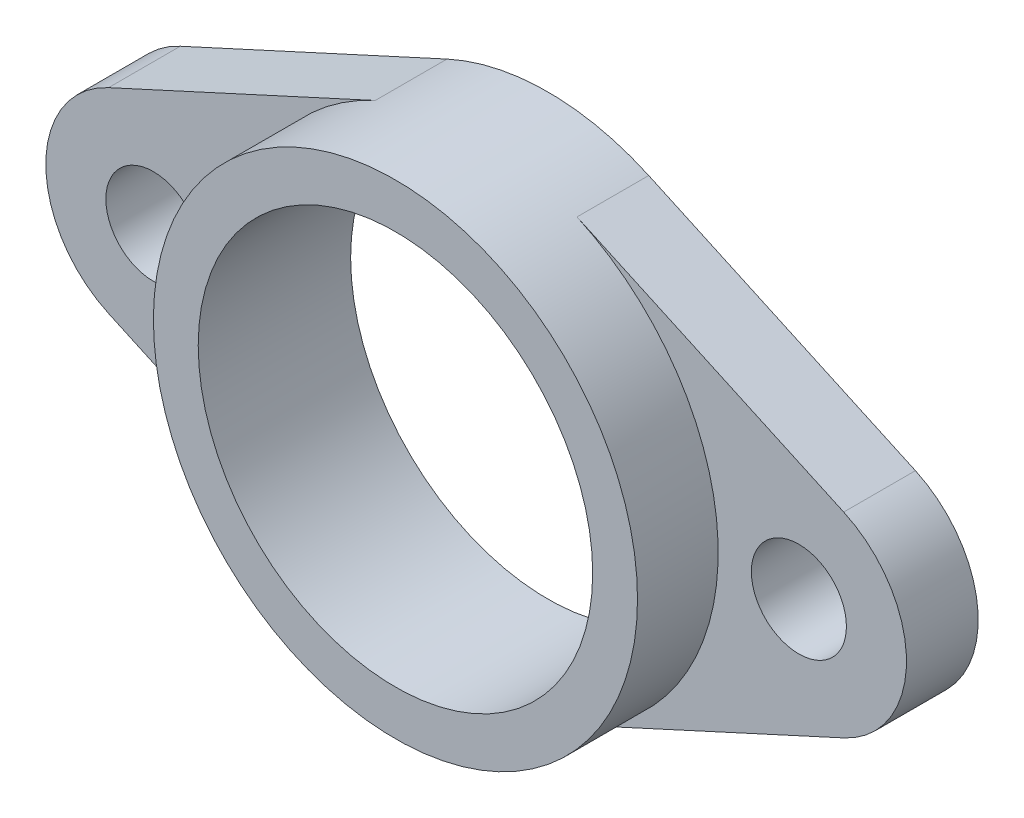
ISO-10303-21;
HEADER;
FILE_DESCRIPTION(('STEP AP214'),'2;1');
FILE_NAME('part.step','',(''),(''),'','','');
FILE_SCHEMA(('AUTOMOTIVE_DESIGN { 1 0 10303 214 1 1 1 1 }'));
ENDSEC;
DATA;
#1=APPLICATION_CONTEXT('core data for automotive mechanical design processes');
#2=APPLICATION_PROTOCOL_DEFINITION('international standard','automotive_design',2000,#1);
#3=PRODUCT_CONTEXT('',#1,'mechanical');
#4=PRODUCT('Part','Part','',(#3));
#5=PRODUCT_RELATED_PRODUCT_CATEGORY('part','',(#4));
#6=PRODUCT_DEFINITION_FORMATION('','',#4);
#7=PRODUCT_DEFINITION_CONTEXT('part definition',#1,'design');
#8=PRODUCT_DEFINITION('design','',#6,#7);
#9=PRODUCT_DEFINITION_SHAPE('','',#8);
#10=(LENGTH_UNIT() NAMED_UNIT(*) SI_UNIT(.MILLI.,.METRE.));
#11=(NAMED_UNIT(*) PLANE_ANGLE_UNIT() SI_UNIT($,.RADIAN.));
#12=(NAMED_UNIT(*) SI_UNIT($,.STERADIAN.) SOLID_ANGLE_UNIT());
#13=UNCERTAINTY_MEASURE_WITH_UNIT(LENGTH_MEASURE(1.E-05),#10,'distance_accuracy_value','');
#14=(GEOMETRIC_REPRESENTATION_CONTEXT(3) GLOBAL_UNCERTAINTY_ASSIGNED_CONTEXT((#13)) GLOBAL_UNIT_ASSIGNED_CONTEXT((#10,
#11,#12)) REPRESENTATION_CONTEXT('',''));
#15=CARTESIAN_POINT('',(0.,0.,0.));
#16=DIRECTION('',(0.,0.,1.));
#17=DIRECTION('',(1.,0.,0.));
#18=AXIS2_PLACEMENT_3D('',#15,#16,#17);
#19=CARTESIAN_POINT('',(-18.,0.,0.));
#20=DIRECTION('',(0.,0.,1.));
#21=DIRECTION('',(1.,0.,0.));
#22=AXIS2_PLACEMENT_3D('',#19,#20,#21);
#23=PLANE('',#22);
#24=CARTESIAN_POINT('',(18.,0.,0.));
#25=DIRECTION('',(0.,0.,-1.));
#26=DIRECTION('',(-1.,0.,0.));
#27=AXIS2_PLACEMENT_3D('',#24,#25,#26);
#28=CIRCLE('',#27,2.65);
#29=CARTESIAN_POINT('',(15.35,0.,0.));
#30=VERTEX_POINT('',#29);
#31=EDGE_CURVE('E195',#30,#30,#28,.T.);
#32=ORIENTED_EDGE('',*,*,#31,.F.);
#33=EDGE_LOOP('',(#32));
#34=FACE_BOUND('',#33,.T.);
#35=CARTESIAN_POINT('',(0.,0.,0.));
#36=DIRECTION('',(0.,0.,1.));
#37=DIRECTION('',(1.,0.,0.));
#38=AXIS2_PLACEMENT_3D('',#35,#36,#37);
#39=CIRCLE('',#38,13.5);
#40=CARTESIAN_POINT('',(-5.625,-12.2723011289652,0.));
#41=VERTEX_POINT('',#40);
#42=CARTESIAN_POINT('',(5.62499999999999,-12.2723011289652,0.));
#43=VERTEX_POINT('',#42);
#44=EDGE_CURVE('E144',#41,#43,#39,.T.);
#45=ORIENTED_EDGE('',*,*,#44,.F.);
#46=DIRECTION('',(0.90905934288631,-0.416666666666666,0.));
#47=VECTOR('',#46,1.);
#48=CARTESIAN_POINT('',(-20.5,-5.45435605731786,0.));
#49=LINE('',#48,#47);
#50=CARTESIAN_POINT('',(-20.5,-5.45435605731786,0.));
#51=VERTEX_POINT('',#50);
#52=EDGE_CURVE('E141',#51,#41,#49,.T.);
#53=ORIENTED_EDGE('',*,*,#52,.F.);
#54=CARTESIAN_POINT('',(-18.,0.,0.));
#55=DIRECTION('',(0.,0.,1.));
#56=DIRECTION('',(1.,0.,0.));
#57=AXIS2_PLACEMENT_3D('',#54,#55,#56);
#58=CIRCLE('',#57,6.);
#59=CARTESIAN_POINT('',(-20.5,5.45435605731786,0.));
#60=VERTEX_POINT('',#59);
#61=EDGE_CURVE('E138',#60,#51,#58,.T.);
#62=ORIENTED_EDGE('',*,*,#61,.F.);
#63=DIRECTION('',(-0.90905934288631,-0.416666666666666,0.));
#64=VECTOR('',#63,1.);
#65=CARTESIAN_POINT('',(-20.5,5.45435605731786,0.));
#66=LINE('',#65,#64);
#67=CARTESIAN_POINT('',(-5.625,12.2723011289652,0.));
#68=VERTEX_POINT('',#67);
#69=EDGE_CURVE('E89',#68,#60,#66,.T.);
#70=ORIENTED_EDGE('',*,*,#69,.F.);
#71=CARTESIAN_POINT('',(0.,0.,0.));
#72=DIRECTION('',(0.,0.,1.));
#73=DIRECTION('',(1.,0.,0.));
#74=AXIS2_PLACEMENT_3D('',#71,#72,#73);
#75=CIRCLE('',#74,13.5);
#76=CARTESIAN_POINT('',(5.625,12.2723011289652,0.));
#77=VERTEX_POINT('',#76);
#78=EDGE_CURVE('E83',#77,#68,#75,.T.);
#79=ORIENTED_EDGE('',*,*,#78,.F.);
#80=DIRECTION('',(-0.90905934288631,0.416666666666666,0.));
#81=VECTOR('',#80,1.);
#82=CARTESIAN_POINT('',(5.625,12.2723011289652,0.));
#83=LINE('',#82,#81);
#84=CARTESIAN_POINT('',(20.5,5.45435605731786,0.));
#85=VERTEX_POINT('',#84);
#86=EDGE_CURVE('E149',#85,#77,#83,.T.);
#87=ORIENTED_EDGE('',*,*,#86,.F.);
#88=CARTESIAN_POINT('',(18.,0.,0.));
#89=DIRECTION('',(0.,0.,1.));
#90=DIRECTION('',(1.,0.,0.));
#91=AXIS2_PLACEMENT_3D('',#88,#89,#90);
#92=CIRCLE('',#91,6.);
#93=CARTESIAN_POINT('',(20.5,-5.45435605731786,0.));
#94=VERTEX_POINT('',#93);
#95=EDGE_CURVE('E147',#94,#85,#92,.T.);
#96=ORIENTED_EDGE('',*,*,#95,.F.);
#97=DIRECTION('',(0.90905934288631,0.416666666666666,0.));
#98=VECTOR('',#97,1.);
#99=CARTESIAN_POINT('',(20.5,-5.45435605731786,0.));
#100=LINE('',#99,#98);
#101=EDGE_CURVE('E122',#43,#94,#100,.T.);
#102=ORIENTED_EDGE('',*,*,#101,.F.);
#103=EDGE_LOOP('',(#45,#53,#62,#70,#79,#87,#96,#102));
#104=FACE_BOUND('',#103,.T.);
#105=CARTESIAN_POINT('',(0.,0.,0.));
#106=DIRECTION('',(0.,0.,1.));
#107=DIRECTION('',(1.,0.,0.));
#108=AXIS2_PLACEMENT_3D('',#105,#106,#107);
#109=CIRCLE('',#108,11.);
#110=CARTESIAN_POINT('',(11.,0.,0.));
#111=VERTEX_POINT('',#110);
#112=EDGE_CURVE('E142',#111,#111,#109,.T.);
#113=ORIENTED_EDGE('',*,*,#112,.T.);
#114=EDGE_LOOP('',(#113));
#115=FACE_BOUND('',#114,.T.);
#116=CARTESIAN_POINT('',(-18.,0.,0.));
#117=DIRECTION('',(0.,0.,-1.));
#118=DIRECTION('',(-1.,0.,0.));
#119=AXIS2_PLACEMENT_3D('',#116,#117,#118);
#120=CIRCLE('',#119,2.65);
#121=CARTESIAN_POINT('',(-20.65,0.,0.));
#122=VERTEX_POINT('',#121);
#123=EDGE_CURVE('E201',#122,#122,#120,.T.);
#124=ORIENTED_EDGE('',*,*,#123,.F.);
#125=EDGE_LOOP('',(#124));
#126=FACE_BOUND('',#125,.T.);
#127=ADVANCED_FACE('F35',(#34,#104,#115,#126),#23,.F.);
#128=CARTESIAN_POINT('',(-18.,0.,4.));
#129=DIRECTION('',(0.,0.,1.));
#130=DIRECTION('',(1.,0.,0.));
#131=AXIS2_PLACEMENT_3D('',#128,#129,#130);
#132=PLANE('',#131);
#133=CARTESIAN_POINT('',(-18.,0.,4.));
#134=DIRECTION('',(0.,0.,1.));
#135=DIRECTION('',(1.,0.,0.));
#136=AXIS2_PLACEMENT_3D('',#133,#134,#135);
#137=CIRCLE('',#136,2.65);
#138=CARTESIAN_POINT('',(-15.35,0.,4.));
#139=VERTEX_POINT('',#138);
#140=EDGE_CURVE('E198',#139,#139,#137,.T.);
#141=ORIENTED_EDGE('',*,*,#140,.F.);
#142=EDGE_LOOP('',(#141));
#143=FACE_BOUND('',#142,.T.);
#144=DIRECTION('',(0.90905934288631,-0.416666666666666,0.));
#145=VECTOR('',#144,1.);
#146=CARTESIAN_POINT('',(-20.5,-5.45435605731786,4.));
#147=LINE('',#146,#145);
#148=CARTESIAN_POINT('',(-20.5,-5.45435605731786,4.));
#149=VERTEX_POINT('',#148);
#150=CARTESIAN_POINT('',(-5.625,-12.2723011289652,4.));
#151=VERTEX_POINT('',#150);
#152=EDGE_CURVE('E97',#149,#151,#147,.T.);
#153=ORIENTED_EDGE('',*,*,#152,.T.);
#154=CARTESIAN_POINT('',(0.,0.,4.));
#155=DIRECTION('',(0.,0.,1.));
#156=DIRECTION('',(1.,0.,0.));
#157=AXIS2_PLACEMENT_3D('',#154,#155,#156);
#158=CIRCLE('',#157,13.5);
#159=CARTESIAN_POINT('',(-5.625,12.2723011289652,4.));
#160=VERTEX_POINT('',#159);
#161=EDGE_CURVE('E165',#151,#160,#158,.F.);
#162=ORIENTED_EDGE('',*,*,#161,.T.);
#163=DIRECTION('',(-0.90905934288631,-0.416666666666666,0.));
#164=VECTOR('',#163,1.);
#165=CARTESIAN_POINT('',(-20.5,5.45435605731786,4.));
#166=LINE('',#165,#164);
#167=CARTESIAN_POINT('',(-20.5,5.45435605731786,4.));
#168=VERTEX_POINT('',#167);
#169=EDGE_CURVE('E52',#160,#168,#166,.T.);
#170=ORIENTED_EDGE('',*,*,#169,.T.);
#171=CARTESIAN_POINT('',(-18.,0.,4.));
#172=DIRECTION('',(0.,0.,1.));
#173=DIRECTION('',(1.,0.,0.));
#174=AXIS2_PLACEMENT_3D('',#171,#172,#173);
#175=CIRCLE('',#174,6.);
#176=EDGE_CURVE('E153',#168,#149,#175,.T.);
#177=ORIENTED_EDGE('',*,*,#176,.T.);
#178=EDGE_LOOP('',(#153,#162,#170,#177));
#179=FACE_BOUND('',#178,.T.);
#180=ADVANCED_FACE('F176',(#143,#179),#132,.T.);
#181=CARTESIAN_POINT('',(18.,0.,4.));
#182=DIRECTION('',(0.,0.,1.));
#183=DIRECTION('',(1.,0.,0.));
#184=AXIS2_PLACEMENT_3D('',#181,#182,#183);
#185=CIRCLE('',#184,2.65);
#186=CARTESIAN_POINT('',(20.65,0.,4.));
#187=VERTEX_POINT('',#186);
#188=EDGE_CURVE('E192',#187,#187,#185,.T.);
#189=ORIENTED_EDGE('',*,*,#188,.F.);
#190=EDGE_LOOP('',(#189));
#191=FACE_BOUND('',#190,.T.);
#192=DIRECTION('',(-0.90905934288631,0.416666666666666,0.));
#193=VECTOR('',#192,1.);
#194=CARTESIAN_POINT('',(5.625,12.2723011289652,4.));
#195=LINE('',#194,#193);
#196=CARTESIAN_POINT('',(20.5,5.45435605731786,4.));
#197=VERTEX_POINT('',#196);
#198=CARTESIAN_POINT('',(5.625,12.2723011289652,4.));
#199=VERTEX_POINT('',#198);
#200=EDGE_CURVE('E131',#197,#199,#195,.T.);
#201=ORIENTED_EDGE('',*,*,#200,.T.);
#202=CARTESIAN_POINT('',(5.62499999999999,-12.2723011289652,4.));
#203=VERTEX_POINT('',#202);
#204=EDGE_CURVE('E113',#199,#203,#158,.F.);
#205=ORIENTED_EDGE('',*,*,#204,.T.);
#206=DIRECTION('',(0.90905934288631,0.416666666666666,0.));
#207=VECTOR('',#206,1.);
#208=CARTESIAN_POINT('',(20.5,-5.45435605731786,4.));
#209=LINE('',#208,#207);
#210=CARTESIAN_POINT('',(20.5,-5.45435605731786,4.));
#211=VERTEX_POINT('',#210);
#212=EDGE_CURVE('E105',#203,#211,#209,.T.);
#213=ORIENTED_EDGE('',*,*,#212,.T.);
#214=CARTESIAN_POINT('',(18.,0.,4.));
#215=DIRECTION('',(0.,0.,1.));
#216=DIRECTION('',(1.,0.,0.));
#217=AXIS2_PLACEMENT_3D('',#214,#215,#216);
#218=CIRCLE('',#217,6.);
#219=EDGE_CURVE('E110',#211,#197,#218,.T.);
#220=ORIENTED_EDGE('',*,*,#219,.T.);
#221=EDGE_LOOP('',(#201,#205,#213,#220));
#222=FACE_BOUND('',#221,.T.);
#223=ADVANCED_FACE('F108',(#191,#222),#132,.T.);
#224=CARTESIAN_POINT('',(-18.,0.,4.));
#225=DIRECTION('',(0.,0.,-1.));
#226=DIRECTION('',(-1.,0.,0.));
#227=AXIS2_PLACEMENT_3D('',#224,#225,#226);
#228=CYLINDRICAL_SURFACE('',#227,6.);
#229=ORIENTED_EDGE('',*,*,#61,.T.);
#230=DIRECTION('',(0.,0.,-1.));
#231=VECTOR('',#230,1.);
#232=CARTESIAN_POINT('',(-20.5,-5.45435605731786,4.));
#233=LINE('',#232,#231);
#234=EDGE_CURVE('E11',#149,#51,#233,.T.);
#235=ORIENTED_EDGE('',*,*,#234,.F.);
#236=ORIENTED_EDGE('',*,*,#176,.F.);
#237=DIRECTION('',(0.,0.,-1.));
#238=VECTOR('',#237,1.);
#239=CARTESIAN_POINT('',(-20.5,5.45435605731786,4.));
#240=LINE('',#239,#238);
#241=EDGE_CURVE('E137',#168,#60,#240,.T.);
#242=ORIENTED_EDGE('',*,*,#241,.T.);
#243=EDGE_LOOP('',(#229,#235,#236,#242));
#244=FACE_BOUND('',#243,.T.);
#245=ADVANCED_FACE('F37',(#244),#228,.T.);
#246=CARTESIAN_POINT('',(-20.5,-5.45435605731786,4.));
#247=DIRECTION('',(0.416666666666666,0.90905934288631,0.));
#248=DIRECTION('',(-0.90905934288631,0.416666666666666,0.));
#249=AXIS2_PLACEMENT_3D('',#246,#247,#248);
#250=PLANE('',#249);
#251=ORIENTED_EDGE('',*,*,#52,.T.);
#252=DIRECTION('',(0.,0.,-1.));
#253=VECTOR('',#252,1.);
#254=CARTESIAN_POINT('',(-5.625,-12.2723011289652,4.));
#255=LINE('',#254,#253);
#256=EDGE_CURVE('E44',#151,#41,#255,.T.);
#257=ORIENTED_EDGE('',*,*,#256,.F.);
#258=ORIENTED_EDGE('',*,*,#152,.F.);
#259=ORIENTED_EDGE('',*,*,#234,.T.);
#260=EDGE_LOOP('',(#251,#257,#258,#259));
#261=FACE_BOUND('',#260,.T.);
#262=ADVANCED_FACE('F229',(#261),#250,.F.);
#263=CARTESIAN_POINT('',(20.5,-5.45435605731786,4.));
#264=DIRECTION('',(-0.416666666666666,0.90905934288631,0.));
#265=DIRECTION('',(-0.90905934288631,-0.416666666666666,0.));
#266=AXIS2_PLACEMENT_3D('',#263,#264,#265);
#267=PLANE('',#266);
#268=ORIENTED_EDGE('',*,*,#101,.T.);
#269=DIRECTION('',(0.,0.,-1.));
#270=VECTOR('',#269,1.);
#271=CARTESIAN_POINT('',(20.5,-5.45435605731786,4.));
#272=LINE('',#271,#270);
#273=EDGE_CURVE('E119',#211,#94,#272,.T.);
#274=ORIENTED_EDGE('',*,*,#273,.F.);
#275=ORIENTED_EDGE('',*,*,#212,.F.);
#276=DIRECTION('',(0.,0.,-1.));
#277=VECTOR('',#276,1.);
#278=CARTESIAN_POINT('',(5.62499999999999,-12.2723011289652,4.));
#279=LINE('',#278,#277);
#280=EDGE_CURVE('E125',#203,#43,#279,.T.);
#281=ORIENTED_EDGE('',*,*,#280,.T.);
#282=EDGE_LOOP('',(#268,#274,#275,#281));
#283=FACE_BOUND('',#282,.T.);
#284=ADVANCED_FACE('F120',(#283),#267,.F.);
#285=CARTESIAN_POINT('',(18.,0.,4.));
#286=DIRECTION('',(0.,0.,-1.));
#287=DIRECTION('',(-1.,0.,0.));
#288=AXIS2_PLACEMENT_3D('',#285,#286,#287);
#289=CYLINDRICAL_SURFACE('',#288,6.);
#290=ORIENTED_EDGE('',*,*,#95,.T.);
#291=DIRECTION('',(0.,0.,-1.));
#292=VECTOR('',#291,1.);
#293=CARTESIAN_POINT('',(20.5,5.45435605731786,4.));
#294=LINE('',#293,#292);
#295=EDGE_CURVE('E126',#197,#85,#294,.T.);
#296=ORIENTED_EDGE('',*,*,#295,.F.);
#297=ORIENTED_EDGE('',*,*,#219,.F.);
#298=ORIENTED_EDGE('',*,*,#273,.T.);
#299=EDGE_LOOP('',(#290,#296,#297,#298));
#300=FACE_BOUND('',#299,.T.);
#301=ADVANCED_FACE('F128',(#300),#289,.T.);
#302=CARTESIAN_POINT('',(5.625,12.2723011289652,4.));
#303=DIRECTION('',(-0.416666666666666,-0.90905934288631,0.));
#304=DIRECTION('',(0.90905934288631,-0.416666666666667,0.));
#305=AXIS2_PLACEMENT_3D('',#302,#303,#304);
#306=PLANE('',#305);
#307=ORIENTED_EDGE('',*,*,#86,.T.);
#308=DIRECTION('',(0.,0.,-1.));
#309=VECTOR('',#308,1.);
#310=CARTESIAN_POINT('',(5.625,12.2723011289652,4.));
#311=LINE('',#310,#309);
#312=EDGE_CURVE('E157',#199,#77,#311,.T.);
#313=ORIENTED_EDGE('',*,*,#312,.F.);
#314=ORIENTED_EDGE('',*,*,#200,.F.);
#315=ORIENTED_EDGE('',*,*,#295,.T.);
#316=EDGE_LOOP('',(#307,#313,#314,#315));
#317=FACE_BOUND('',#316,.T.);
#318=ADVANCED_FACE('F171',(#317),#306,.F.);
#319=CARTESIAN_POINT('',(0.,0.,4.));
#320=DIRECTION('',(0.,0.,-1.));
#321=DIRECTION('',(-1.,0.,0.));
#322=AXIS2_PLACEMENT_3D('',#319,#320,#321);
#323=CYLINDRICAL_SURFACE('',#322,13.5);
#324=ORIENTED_EDGE('',*,*,#78,.T.);
#325=DIRECTION('',(0.,0.,-1.));
#326=VECTOR('',#325,1.);
#327=CARTESIAN_POINT('',(-5.625,12.2723011289652,4.));
#328=LINE('',#327,#326);
#329=EDGE_CURVE('E155',#160,#68,#328,.T.);
#330=ORIENTED_EDGE('',*,*,#329,.F.);
#331=ORIENTED_EDGE('',*,*,#161,.F.);
#332=ORIENTED_EDGE('',*,*,#256,.T.);
#333=ORIENTED_EDGE('',*,*,#44,.T.);
#334=ORIENTED_EDGE('',*,*,#280,.F.);
#335=ORIENTED_EDGE('',*,*,#204,.F.);
#336=ORIENTED_EDGE('',*,*,#312,.T.);
#337=EDGE_LOOP('',(#324,#330,#331,#332,#333,#334,#335,#336));
#338=FACE_BOUND('',#337,.T.);
#339=CARTESIAN_POINT('',(0.,0.,8.5));
#340=DIRECTION('',(0.,0.,1.));
#341=DIRECTION('',(1.,0.,0.));
#342=AXIS2_PLACEMENT_3D('',#339,#340,#341);
#343=CIRCLE('',#342,13.5);
#344=CARTESIAN_POINT('',(13.5,0.,8.5));
#345=VERTEX_POINT('',#344);
#346=EDGE_CURVE('E186',#345,#345,#343,.T.);
#347=ORIENTED_EDGE('',*,*,#346,.F.);
#348=EDGE_LOOP('',(#347));
#349=FACE_BOUND('',#348,.T.);
#350=ADVANCED_FACE('F163',(#338,#349),#323,.T.);
#351=CARTESIAN_POINT('',(-20.5,5.45435605731786,4.));
#352=DIRECTION('',(0.416666666666666,-0.90905934288631,0.));
#353=DIRECTION('',(0.90905934288631,0.416666666666666,0.));
#354=AXIS2_PLACEMENT_3D('',#351,#352,#353);
#355=PLANE('',#354);
#356=ORIENTED_EDGE('',*,*,#69,.T.);
#357=ORIENTED_EDGE('',*,*,#241,.F.);
#358=ORIENTED_EDGE('',*,*,#169,.F.);
#359=ORIENTED_EDGE('',*,*,#329,.T.);
#360=EDGE_LOOP('',(#356,#357,#358,#359));
#361=FACE_BOUND('',#360,.T.);
#362=ADVANCED_FACE('F178',(#361),#355,.F.);
#363=CARTESIAN_POINT('',(0.,0.,4.));
#364=DIRECTION('',(0.,0.,-1.));
#365=DIRECTION('',(-1.,0.,0.));
#366=AXIS2_PLACEMENT_3D('',#363,#364,#365);
#367=CYLINDRICAL_SURFACE('',#366,11.);
#368=ORIENTED_EDGE('',*,*,#112,.F.);
#369=EDGE_LOOP('',(#368));
#370=FACE_BOUND('',#369,.T.);
#371=CARTESIAN_POINT('',(0.,0.,8.5));
#372=DIRECTION('',(0.,0.,1.));
#373=DIRECTION('',(1.,0.,0.));
#374=AXIS2_PLACEMENT_3D('',#371,#372,#373);
#375=CIRCLE('',#374,11.);
#376=CARTESIAN_POINT('',(11.,0.,8.5));
#377=VERTEX_POINT('',#376);
#378=EDGE_CURVE('E189',#377,#377,#375,.T.);
#379=ORIENTED_EDGE('',*,*,#378,.T.);
#380=EDGE_LOOP('',(#379));
#381=FACE_BOUND('',#380,.T.);
#382=ADVANCED_FACE('F221',(#370,#381),#367,.F.);
#383=CARTESIAN_POINT('',(0.,0.,8.5));
#384=DIRECTION('',(0.,0.,1.));
#385=DIRECTION('',(1.,0.,0.));
#386=AXIS2_PLACEMENT_3D('',#383,#384,#385);
#387=PLANE('',#386);
#388=ORIENTED_EDGE('',*,*,#346,.T.);
#389=EDGE_LOOP('',(#388));
#390=FACE_BOUND('',#389,.T.);
#391=ORIENTED_EDGE('',*,*,#378,.F.);
#392=EDGE_LOOP('',(#391));
#393=FACE_BOUND('',#392,.T.);
#394=ADVANCED_FACE('F244',(#390,#393),#387,.T.);
#395=CARTESIAN_POINT('',(18.,0.,0.));
#396=DIRECTION('',(0.,0.,-1.));
#397=DIRECTION('',(-1.,0.,0.));
#398=AXIS2_PLACEMENT_3D('',#395,#396,#397);
#399=CYLINDRICAL_SURFACE('',#398,2.65);
#400=ORIENTED_EDGE('',*,*,#31,.T.);
#401=EDGE_LOOP('',(#400));
#402=FACE_BOUND('',#401,.T.);
#403=ORIENTED_EDGE('',*,*,#188,.T.);
#404=EDGE_LOOP('',(#403));
#405=FACE_BOUND('',#404,.T.);
#406=ADVANCED_FACE('F242',(#402,#405),#399,.F.);
#407=CARTESIAN_POINT('',(-18.,0.,0.));
#408=DIRECTION('',(0.,0.,-1.));
#409=DIRECTION('',(-1.,0.,0.));
#410=AXIS2_PLACEMENT_3D('',#407,#408,#409);
#411=CYLINDRICAL_SURFACE('',#410,2.65);
#412=ORIENTED_EDGE('',*,*,#123,.T.);
#413=EDGE_LOOP('',(#412));
#414=FACE_BOUND('',#413,.T.);
#415=ORIENTED_EDGE('',*,*,#140,.T.);
#416=EDGE_LOOP('',(#415));
#417=FACE_BOUND('',#416,.T.);
#418=ADVANCED_FACE('F205',(#414,#417),#411,.F.);
#419=CLOSED_SHELL('',(#127,#180,#223,#245,#262,#284,#301,#318,#350,#362,#382,#394,#406,#418));
#420=MANIFOLD_SOLID_BREP('B2',#419);
#421=ADVANCED_BREP_SHAPE_REPRESENTATION('',(#18,#420),#14);
#422=SHAPE_DEFINITION_REPRESENTATION(#9,#421);
ENDSEC;
END-ISO-10303-21;
